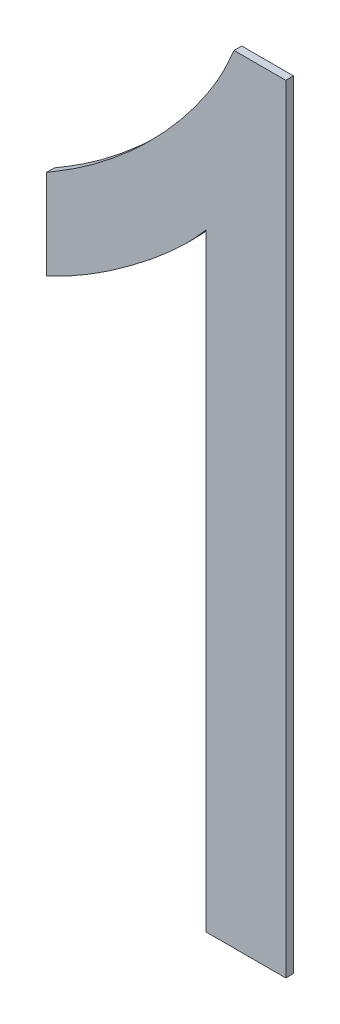
ISO-10303-21;
HEADER;
FILE_DESCRIPTION(('STEP AP214'),'2;1');
FILE_NAME('part.step','',(''),(''),'','','');
FILE_SCHEMA(('AUTOMOTIVE_DESIGN { 1 0 10303 214 1 1 1 1 }'));
ENDSEC;
DATA;
#1=APPLICATION_CONTEXT('core data for automotive mechanical design processes');
#2=APPLICATION_PROTOCOL_DEFINITION('international standard','automotive_design',2000,#1);
#3=PRODUCT_CONTEXT('',#1,'mechanical');
#4=PRODUCT('Part','Part','',(#3));
#5=PRODUCT_RELATED_PRODUCT_CATEGORY('part','',(#4));
#6=PRODUCT_DEFINITION_FORMATION('','',#4);
#7=PRODUCT_DEFINITION_CONTEXT('part definition',#1,'design');
#8=PRODUCT_DEFINITION('design','',#6,#7);
#9=PRODUCT_DEFINITION_SHAPE('','',#8);
#10=(LENGTH_UNIT() NAMED_UNIT(*) SI_UNIT(.MILLI.,.METRE.));
#11=(NAMED_UNIT(*) PLANE_ANGLE_UNIT() SI_UNIT($,.RADIAN.));
#12=(NAMED_UNIT(*) SI_UNIT($,.STERADIAN.) SOLID_ANGLE_UNIT());
#13=UNCERTAINTY_MEASURE_WITH_UNIT(LENGTH_MEASURE(1.E-05),#10,'distance_accuracy_value','');
#14=(GEOMETRIC_REPRESENTATION_CONTEXT(3) GLOBAL_UNCERTAINTY_ASSIGNED_CONTEXT((#13)) GLOBAL_UNIT_ASSIGNED_CONTEXT((#10,
#11,#12)) REPRESENTATION_CONTEXT('',''));
#15=CARTESIAN_POINT('',(0.,0.,0.));
#16=DIRECTION('',(0.,0.,1.));
#17=DIRECTION('',(1.,0.,0.));
#18=AXIS2_PLACEMENT_3D('',#15,#16,#17);
#19=CARTESIAN_POINT('',(58.1743453155129,26.8742028686675,2.91549564475552));
#20=DIRECTION('',(0.,0.,1.));
#21=DIRECTION('',(1.,0.,0.));
#22=AXIS2_PLACEMENT_3D('',#19,#20,#21);
#23=PLANE('',#22);
#24=DIRECTION('',(1.,0.,0.));
#25=VECTOR('',#24,1.);
#26=CARTESIAN_POINT('',(58.3745452295853,26.170000462748,2.91549564475552));
#27=LINE('',#26,#25);
#28=CARTESIAN_POINT('',(58.2706491256892,26.170000462748,2.91549564475552));
#29=VERTEX_POINT('',#28);
#30=CARTESIAN_POINT('',(58.3745452295853,26.170000462748,2.91549564475552));
#31=VERTEX_POINT('',#30);
#32=EDGE_CURVE('E123',#29,#31,#27,.T.);
#33=ORIENTED_EDGE('',*,*,#32,.F.);
#34=DIRECTION('',(0.,-1.,0.));
#35=VECTOR('',#34,1.);
#36=CARTESIAN_POINT('',(58.2706491256892,26.170000462748,2.91549564475552));
#37=LINE('',#36,#35);
#38=CARTESIAN_POINT('',(58.2706491256892,26.9622082549558,2.91549564475552));
#39=VERTEX_POINT('',#38);
#40=EDGE_CURVE('E126',#39,#29,#37,.T.);
#41=ORIENTED_EDGE('',*,*,#40,.F.);
#42=CARTESIAN_POINT('',(58.062856917897,26.8063640991116,2.91549564475552));
#43=CARTESIAN_POINT('',(58.065866863255,26.8077974042156,2.91549564475551));
#44=CARTESIAN_POINT('',(58.0688796080204,26.8092255044285,2.91549564475551));
#45=CARTESIAN_POINT('',(58.0748895244834,26.8121116580423,2.91549564475552));
#46=CARTESIAN_POINT('',(58.0778867005587,26.8135697023804,2.91549564475552));
#47=CARTESIAN_POINT('',(58.0868442865377,26.8180597651495,2.91549564475553));
#48=CARTESIAN_POINT('',(58.0927518760436,26.8211993494741,2.91549564475552));
#49=CARTESIAN_POINT('',(58.1044058272643,26.8277655902408,2.91549564475551));
#50=CARTESIAN_POINT('',(58.1101521124175,26.8311923800267,2.91549564475552));
#51=CARTESIAN_POINT('',(58.1272955683468,26.8416498466397,2.91549564475552));
#52=CARTESIAN_POINT('',(58.1385896613481,26.8488533489662,2.91549564475552));
#53=CARTESIAN_POINT('',(58.1551203664206,26.8602081022204,2.91549564475552));
#54=CARTESIAN_POINT('',(58.1605514245685,26.8640760719348,2.91549564475552));
#55=CARTESIAN_POINT('',(58.1713285643238,26.8719286843331,2.91549564475552));
#56=CARTESIAN_POINT('',(58.1766746366933,26.8759133395687,2.91549564475552));
#57=CARTESIAN_POINT('',(58.1872741399798,26.8839934929051,2.91549564475552));
#58=CARTESIAN_POINT('',(58.1925276618194,26.8880888708966,2.91549564475552));
#59=CARTESIAN_POINT('',(58.2029035866979,26.8964436602983,2.91549564475552));
#60=CARTESIAN_POINT('',(58.2080259836991,26.9007030792392,2.91549564475552));
#61=CARTESIAN_POINT('',(58.2182160142135,26.9094403138401,2.91549564475552));
#62=CARTESIAN_POINT('',(58.2232816300345,26.9139204657974,2.91549564475552));
#63=CARTESIAN_POINT('',(58.2333000981316,26.9230041410037,2.91549564475552));
#64=CARTESIAN_POINT('',(58.2382529799468,26.9276076312304,2.91549564475552));
#65=CARTESIAN_POINT('',(58.2455076860161,26.9347021503229,2.91549564475552));
#66=CARTESIAN_POINT('',(58.2478990069233,26.9371009062007,2.91549564475552));
#67=CARTESIAN_POINT('',(58.2526006522834,26.9419773170162,2.91549564475552));
#68=CARTESIAN_POINT('',(58.2549109622826,26.9444549858841,2.91549564475552));
#69=CARTESIAN_POINT('',(58.25947437728,26.9494660903726,2.91549564475552));
#70=CARTESIAN_POINT('',(58.2617274271182,26.951999575681,2.91549564475553));
#71=CARTESIAN_POINT('',(58.2662032792995,26.9570917109337,2.91549564475552));
#72=CARTESIAN_POINT('',(58.2684260916151,26.9596503520772,2.91549564475552));
#73=CARTESIAN_POINT('',(58.2706491256892,26.9622082549558,2.91549564475551));
#74=B_SPLINE_CURVE_WITH_KNOTS('',3,(#42,#43,#44,#45,#46,#47,#48,#49,#50,#51,#52,#53,#54,#55,#56,
#57,#58,#59,#60,#61,#62,#63,#64,#65,#66,#67,#68,#69,#70,#71,#72,#73),.UNSPECIFIED.,.F.,.F.,(4,2,
2,2,2,2,2,2,2,2,2,2,2,2,2,4),(0.,0.010001847268972,0.0200007107640943,0.040060332963255,
0.0601293205800113,0.100293640248044,0.12029354974647,0.140295618573345,0.160276797467611,
0.180258894757743,0.200544891582343,0.220825510313653,0.230985139908888,0.241146573014351,
0.251317449835132,0.261484886723193),.UNSPECIFIED.);
#75=CARTESIAN_POINT('',(58.062856917897,26.8063640991116,2.91549564475552));
#76=VERTEX_POINT('',#75);
#77=EDGE_CURVE('E86',#76,#39,#74,.T.);
#78=ORIENTED_EDGE('',*,*,#77,.F.);
#79=DIRECTION('',(0.,-1.,0.));
#80=VECTOR('',#79,1.);
#81=CARTESIAN_POINT('',(58.062856917897,26.8063640991116,2.91549564475552));
#82=LINE('',#81,#80);
#83=CARTESIAN_POINT('',(58.062856917897,26.9232472159948,2.91549564475552));
#84=VERTEX_POINT('',#83);
#85=EDGE_CURVE('E84',#84,#76,#82,.T.);
#86=ORIENTED_EDGE('',*,*,#85,.F.);
#87=CARTESIAN_POINT('',(58.3071750997152,27.182987475735,2.91549564475552));
#88=CARTESIAN_POINT('',(58.3058388196954,27.1799333253941,2.91549564475553));
#89=CARTESIAN_POINT('',(58.3045037543781,27.1768788234238,2.91549564475553));
#90=CARTESIAN_POINT('',(58.3018046805023,27.1707829365755,2.91549564475552));
#91=CARTESIAN_POINT('',(58.3004406738737,27.1677415508389,2.91549564475552));
#92=CARTESIAN_POINT('',(58.2962376004407,27.1586130404315,2.91549564475551));
#93=CARTESIAN_POINT('',(58.2933060358809,27.1525664836575,2.91549564475552));
#94=CARTESIAN_POINT('',(58.287008443503,27.140702659199,2.91549564475553));
#95=CARTESIAN_POINT('',(58.2836423786988,27.1348854110891,2.91549564475553));
#96=CARTESIAN_POINT('',(58.2766142265739,27.1234304012939,2.91549564475552));
#97=CARTESIAN_POINT('',(58.2729519123752,27.1177927818691,2.91549564475553));
#98=CARTESIAN_POINT('',(58.2654206461902,27.1066556966935,2.91549564475552));
#99=CARTESIAN_POINT('',(58.2615516435777,27.1011562652799,2.91549564475552));
#100=CARTESIAN_POINT('',(58.2525507776012,27.0888512674793,2.91549564475552));
#101=CARTESIAN_POINT('',(58.2473580501864,27.0820900311211,2.91549564475552));
#102=CARTESIAN_POINT('',(58.2366741386901,27.0688110263768,2.91549564475553));
#103=CARTESIAN_POINT('',(58.2311829976326,27.062293223121,2.91549564475552));
#104=CARTESIAN_POINT('',(58.2143146205282,27.0430774469248,2.91549564475552));
#105=CARTESIAN_POINT('',(58.2025443658314,27.0307197107892,2.91549564475552));
#106=CARTESIAN_POINT('',(58.1807006464426,27.0096257308247,2.91549564475552));
#107=CARTESIAN_POINT('',(58.1708196383605,27.0006888316662,2.91549564475552));
#108=CARTESIAN_POINT('',(58.1556015841505,26.9877509751638,2.91549564475552));
#109=CARTESIAN_POINT('',(58.1504619416585,26.9835156214841,2.91549564475552));
#110=CARTESIAN_POINT('',(58.1400695044533,26.9751868406897,2.91549564475552));
#111=CARTESIAN_POINT('',(58.1348167201312,26.9710934006306,2.91549564475552));
#112=CARTESIAN_POINT('',(58.1241902688453,26.9630773752128,2.91549564475552));
#113=CARTESIAN_POINT('',(58.1188167326587,26.959154617359,2.91549564475552));
#114=CARTESIAN_POINT('',(58.1079208644632,26.9515195167154,2.91549564475552));
#115=CARTESIAN_POINT('',(58.1023985152648,26.9478071983887,2.91549564475552));
#116=CARTESIAN_POINT('',(58.0912330599455,26.9405746466174,2.91549564475552));
#117=CARTESIAN_POINT('',(58.0855899877156,26.9370543602232,2.91549564475551));
#118=CARTESIAN_POINT('',(58.0742487255015,26.9301063894129,2.91549564475552));
#119=CARTESIAN_POINT('',(58.0685505499406,26.9266786816104,2.91549564475552));
#120=CARTESIAN_POINT('',(58.062856917897,26.9232472159948,2.91549564475553));
#121=B_SPLINE_CURVE_WITH_KNOTS('',3,(#87,#88,#89,#90,#91,#92,#93,#94,#95,#96,#97,#98,#99,#100,
#101,#102,#103,#104,#105,#106,#107,#108,#109,#110,#111,#112,#113,#114,#115,#116,#117,#118,#119,
#120),.UNSPECIFIED.,.F.,.F.,(4,2,2,2,2,2,2,2,2,2,2,2,2,2,2,2,4),(0.,0.0100006477746493,
0.0200006307128625,0.0401463791712754,0.0602938436370256,0.0804568865149613,0.10062489095737,
0.126190331127146,0.151752095105202,0.202885326196961,0.242827177162792,0.262804596179576,
0.28278018817464,0.302735099846907,0.322692326496227,0.342644022169759,0.362590629734804),.UNSPECIFIED.);
#122=CARTESIAN_POINT('',(58.3071750997152,27.182987475735,2.91549564475552));
#123=VERTEX_POINT('',#122);
#124=EDGE_CURVE('E24',#123,#84,#121,.T.);
#125=ORIENTED_EDGE('',*,*,#124,.F.);
#126=DIRECTION('',(-1.,0.,0.));
#127=VECTOR('',#126,1.);
#128=CARTESIAN_POINT('',(58.3071750997152,27.182987475735,2.91549564475552));
#129=LINE('',#128,#127);
#130=CARTESIAN_POINT('',(58.3745452295853,27.182987475735,2.91549564475552));
#131=VERTEX_POINT('',#130);
#132=EDGE_CURVE('E111',#131,#123,#129,.T.);
#133=ORIENTED_EDGE('',*,*,#132,.F.);
#134=DIRECTION('',(0.,1.,0.));
#135=VECTOR('',#134,1.);
#136=CARTESIAN_POINT('',(58.3745452295853,27.182987475735,2.91549564475552));
#137=LINE('',#136,#135);
#138=EDGE_CURVE('E135',#31,#131,#137,.T.);
#139=ORIENTED_EDGE('',*,*,#138,.F.);
#140=EDGE_LOOP('',(#33,#41,#78,#86,#125,#133,#139));
#141=FACE_BOUND('',#140,.T.);
#142=ADVANCED_FACE('F17',(#141),#23,.F.);
#143=CARTESIAN_POINT('',(58.3745452295853,27.182987475735,2.92549564475551));
#144=DIRECTION('',(1.,0.,0.));
#145=DIRECTION('',(0.,1.,0.));
#146=AXIS2_PLACEMENT_3D('',#143,#144,#145);
#147=PLANE('',#146);
#148=DIRECTION('',(0.,1.,0.));
#149=VECTOR('',#148,1.);
#150=CARTESIAN_POINT('',(58.3745452295853,26.8742028686675,2.92549564475552));
#151=LINE('',#150,#149);
#152=CARTESIAN_POINT('',(58.3745452295853,26.170000462748,2.92549564475552));
#153=VERTEX_POINT('',#152);
#154=CARTESIAN_POINT('',(58.3745452295853,27.182987475735,2.92549564475552));
#155=VERTEX_POINT('',#154);
#156=EDGE_CURVE('E114',#153,#155,#151,.T.);
#157=ORIENTED_EDGE('',*,*,#156,.F.);
#158=DIRECTION('',(0.,0.,1.));
#159=VECTOR('',#158,1.);
#160=CARTESIAN_POINT('',(58.3745452295853,26.170000462748,2.92549564475551));
#161=LINE('',#160,#159);
#162=EDGE_CURVE('E120',#31,#153,#161,.T.);
#163=ORIENTED_EDGE('',*,*,#162,.F.);
#164=ORIENTED_EDGE('',*,*,#138,.T.);
#165=DIRECTION('',(0.,0.,1.));
#166=VECTOR('',#165,1.);
#167=CARTESIAN_POINT('',(58.3745452295853,27.182987475735,2.92549564475551));
#168=LINE('',#167,#166);
#169=EDGE_CURVE('E98',#155,#131,#168,.F.);
#170=ORIENTED_EDGE('',*,*,#169,.F.);
#171=EDGE_LOOP('',(#157,#163,#164,#170));
#172=FACE_BOUND('',#171,.T.);
#173=ADVANCED_FACE('F172',(#172),#147,.T.);
#174=CARTESIAN_POINT('',(58.3071750997152,27.182987475735,2.92549564475551));
#175=DIRECTION('',(0.,1.,0.));
#176=DIRECTION('',(-1.,0.,0.));
#177=AXIS2_PLACEMENT_3D('',#174,#175,#176);
#178=PLANE('',#177);
#179=DIRECTION('',(1.,0.,0.));
#180=VECTOR('',#179,1.);
#181=CARTESIAN_POINT('',(58.1743453155129,27.182987475735,2.92549564475551));
#182=LINE('',#181,#180);
#183=CARTESIAN_POINT('',(58.3071750997152,27.182987475735,2.92549564475551));
#184=VERTEX_POINT('',#183);
#185=EDGE_CURVE('E117',#155,#184,#182,.F.);
#186=ORIENTED_EDGE('',*,*,#185,.F.);
#187=ORIENTED_EDGE('',*,*,#169,.T.);
#188=ORIENTED_EDGE('',*,*,#132,.T.);
#189=DIRECTION('',(0.,0.,-1.));
#190=VECTOR('',#189,1.);
#191=CARTESIAN_POINT('',(58.3071750997152,27.182987475735,2.92049564475552));
#192=LINE('',#191,#190);
#193=EDGE_CURVE('E91',#184,#123,#192,.T.);
#194=ORIENTED_EDGE('',*,*,#193,.F.);
#195=EDGE_LOOP('',(#186,#187,#188,#194));
#196=FACE_BOUND('',#195,.T.);
#197=ADVANCED_FACE('F169',(#196),#178,.T.);
#198=CARTESIAN_POINT('',(58.062856917897,26.9232472159948,2.92549564475551));
#199=CARTESIAN_POINT('',(58.062856917897,26.9232472159948,2.91549564475552));
#200=CARTESIAN_POINT('',(58.0768699526042,26.9316820539989,2.92549564475551));
#201=CARTESIAN_POINT('',(58.0768699526042,26.9316820539989,2.91549564475552));
#202=CARTESIAN_POINT('',(58.1047760319953,26.948479504652,2.92549564475551));
#203=CARTESIAN_POINT('',(58.1047760319953,26.948479504652,2.91549564475552));
#204=CARTESIAN_POINT('',(58.1438896877577,26.9775635811955,2.92549564475551));
#205=CARTESIAN_POINT('',(58.1438896877577,26.9775635811955,2.91549564475552));
#206=CARTESIAN_POINT('',(58.1808222893721,27.0090432588623,2.92549564475551));
#207=CARTESIAN_POINT('',(58.1808222893721,27.0090432588623,2.91549564475552));
#208=CARTESIAN_POINT('',(58.2146838854584,27.0429586692716,2.92549564475551));
#209=CARTESIAN_POINT('',(58.2146838854584,27.0429586692716,2.91549564475552));
#210=CARTESIAN_POINT('',(58.2448641482385,27.0780495871445,2.92549564475551));
#211=CARTESIAN_POINT('',(58.2448641482385,27.0780495871445,2.91549564475552));
#212=CARTESIAN_POINT('',(58.2705005129144,27.113195805795,2.92549564475551));
#213=CARTESIAN_POINT('',(58.2705005129144,27.113195805795,2.91549564475552));
#214=CARTESIAN_POINT('',(58.2917484560982,27.1477049930124,2.92549564475551));
#215=CARTESIAN_POINT('',(58.2917484560982,27.1477049930124,2.91549564475552));
#216=CARTESIAN_POINT('',(58.302150686457,27.171496073044,2.92549564475551));
#217=CARTESIAN_POINT('',(58.302150686457,27.171496073044,2.91549564475552));
#218=CARTESIAN_POINT('',(58.3071750997152,27.182987475735,2.92549564475551));
#219=CARTESIAN_POINT('',(58.3071750997152,27.182987475735,2.91549564475552));
#220=B_SPLINE_SURFACE_WITH_KNOTS('',3,1,((#198,#199),(#200,#201),(#202,#203),(#204,#205),(#206,
#207),(#208,#209),(#210,#211),(#212,#213),(#214,#215),(#216,#217),(#218,#219)),.UNSPECIFIED.,
.F.,.F.,.F.,(4,1,1,1,1,1,1,1,4),(2,2),(0.,0.13527525967826,0.26939219199274,0.402774776977784,
0.536551389096526,0.665562751742143,0.785356715344345,0.89632448734492,1.),(0.,1.),.UNSPECIFIED.);
#221=CARTESIAN_POINT('',(58.3071750997152,27.182987475735,2.92549564475551));
#222=CARTESIAN_POINT('',(58.3058388196954,27.1799333253941,2.92549564475552));
#223=CARTESIAN_POINT('',(58.3045037543781,27.1768788234238,2.92549564475552));
#224=CARTESIAN_POINT('',(58.3018046805023,27.1707829365755,2.92549564475551));
#225=CARTESIAN_POINT('',(58.3004406738737,27.1677415508389,2.92549564475551));
#226=CARTESIAN_POINT('',(58.2962376004407,27.1586130404315,2.9254956447555));
#227=CARTESIAN_POINT('',(58.2933060358809,27.1525664836575,2.92549564475551));
#228=CARTESIAN_POINT('',(58.287008443503,27.140702659199,2.92549564475552));
#229=CARTESIAN_POINT('',(58.2836423786988,27.1348854110891,2.92549564475552));
#230=CARTESIAN_POINT('',(58.2766142265739,27.1234304012939,2.92549564475551));
#231=CARTESIAN_POINT('',(58.2729519123752,27.117792781869,2.92549564475552));
#232=CARTESIAN_POINT('',(58.2654206461902,27.1066556966935,2.92549564475551));
#233=CARTESIAN_POINT('',(58.2615516435777,27.1011562652799,2.92549564475551));
#234=CARTESIAN_POINT('',(58.2525507776012,27.0888512674793,2.92549564475551));
#235=CARTESIAN_POINT('',(58.2473580501864,27.0820900311211,2.92549564475551));
#236=CARTESIAN_POINT('',(58.2366741386901,27.0688110263768,2.92549564475552));
#237=CARTESIAN_POINT('',(58.2311829976326,27.062293223121,2.92549564475551));
#238=CARTESIAN_POINT('',(58.2143146205282,27.0430774469248,2.92549564475551));
#239=CARTESIAN_POINT('',(58.2025443658314,27.0307197107892,2.92549564475551));
#240=CARTESIAN_POINT('',(58.1807006464426,27.0096257308247,2.92549564475551));
#241=CARTESIAN_POINT('',(58.1708196383605,27.0006888316662,2.92549564475551));
#242=CARTESIAN_POINT('',(58.1556015841505,26.9877509751638,2.92549564475551));
#243=CARTESIAN_POINT('',(58.1504619416585,26.9835156214841,2.92549564475551));
#244=CARTESIAN_POINT('',(58.1400695044533,26.9751868406897,2.92549564475551));
#245=CARTESIAN_POINT('',(58.1348167201312,26.9710934006306,2.92549564475551));
#246=CARTESIAN_POINT('',(58.1241902688453,26.9630773752128,2.92549564475551));
#247=CARTESIAN_POINT('',(58.1188167326587,26.959154617359,2.92549564475551));
#248=CARTESIAN_POINT('',(58.1079208644632,26.9515195167154,2.92549564475551));
#249=CARTESIAN_POINT('',(58.1023985152647,26.9478071983887,2.92549564475551));
#250=CARTESIAN_POINT('',(58.0912330599455,26.9405746466174,2.92549564475551));
#251=CARTESIAN_POINT('',(58.0855899877155,26.9370543602232,2.9254956447555));
#252=CARTESIAN_POINT('',(58.0742487255015,26.9301063894129,2.92549564475551));
#253=CARTESIAN_POINT('',(58.0685505499406,26.9266786816104,2.92549564475551));
#254=CARTESIAN_POINT('',(58.062856917897,26.9232472159948,2.92549564475552));
#255=B_SPLINE_CURVE_WITH_KNOTS('',3,(#221,#222,#223,#224,#225,#226,#227,#228,#229,#230,#231,
#232,#233,#234,#235,#236,#237,#238,#239,#240,#241,#242,#243,#244,#245,#246,#247,#248,#249,#250,
#251,#252,#253,#254),.UNSPECIFIED.,.F.,.F.,(4,2,2,2,2,2,2,2,2,2,2,2,2,2,2,2,4),(0.,
0.0100006477746493,0.0200006307128625,0.0401463791712784,0.0602938436370277,0.0804568865149643,
0.100624890957369,0.126190331127141,0.151752095105203,0.202885326196959,0.24282717716279,
0.262804596179574,0.282780188174638,0.302735099846908,0.322692326496222,0.342644022169765,
0.362590629734802),.UNSPECIFIED.);
#256=CARTESIAN_POINT('',(58.062856917897,26.9232472159948,2.9254956447555));
#257=VERTEX_POINT('',#256);
#258=EDGE_CURVE('E150',#184,#257,#255,.T.);
#259=DIRECTION('',(0.,0.,1.));
#260=VECTOR('',#259,1.);
#261=CARTESIAN_POINT('',(58.062856917897,26.9232472159948,2.92549564475551));
#262=LINE('',#261,#260);
#263=EDGE_CURVE('E90',#257,#84,#262,.F.);
#264=ORIENTED_EDGE('',*,*,#258,.F.);
#265=ORIENTED_EDGE('',*,*,#193,.T.);
#266=ORIENTED_EDGE('',*,*,#124,.T.);
#267=ORIENTED_EDGE('',*,*,#263,.F.);
#268=EDGE_LOOP('',(#264,#265,#266,#267));
#269=FACE_BOUND('',#268,.T.);
#270=ADVANCED_FACE('F96',(#269),#220,.T.);
#271=CARTESIAN_POINT('',(58.062856917897,26.8063640991116,2.92549564475551));
#272=DIRECTION('',(-1.,0.,0.));
#273=DIRECTION('',(0.,-1.,0.));
#274=AXIS2_PLACEMENT_3D('',#271,#272,#273);
#275=PLANE('',#274);
#276=DIRECTION('',(0.,1.,0.));
#277=VECTOR('',#276,1.);
#278=CARTESIAN_POINT('',(58.062856917897,26.8742028686675,2.9254956447555));
#279=LINE('',#278,#277);
#280=CARTESIAN_POINT('',(58.062856917897,26.8063640991116,2.92549564475551));
#281=VERTEX_POINT('',#280);
#282=EDGE_CURVE('E101',#257,#281,#279,.F.);
#283=ORIENTED_EDGE('',*,*,#282,.F.);
#284=ORIENTED_EDGE('',*,*,#263,.T.);
#285=ORIENTED_EDGE('',*,*,#85,.T.);
#286=DIRECTION('',(0.,0.,-1.));
#287=VECTOR('',#286,1.);
#288=CARTESIAN_POINT('',(58.062856917897,26.8063640991116,2.92049564475552));
#289=LINE('',#288,#287);
#290=EDGE_CURVE('E104',#281,#76,#289,.T.);
#291=ORIENTED_EDGE('',*,*,#290,.F.);
#292=EDGE_LOOP('',(#283,#284,#285,#291));
#293=FACE_BOUND('',#292,.T.);
#294=ADVANCED_FACE('F99',(#293),#275,.T.);
#295=CARTESIAN_POINT('',(58.2706491256892,26.9622082549558,2.92549564475551));
#296=CARTESIAN_POINT('',(58.2706491256892,26.9622082549558,2.91549564475552));
#297=CARTESIAN_POINT('',(58.2642680764825,26.9548641128363,2.92549564475551));
#298=CARTESIAN_POINT('',(58.2642680764825,26.9548641128363,2.91549564475552));
#299=CARTESIAN_POINT('',(58.251043358538,26.9396433858168,2.92549564475551));
#300=CARTESIAN_POINT('',(58.251043358538,26.9396433858168,2.91549564475552));
#301=CARTESIAN_POINT('',(58.2280943384595,26.9179870513999,2.92549564475551));
#302=CARTESIAN_POINT('',(58.2280943384595,26.9179870513999,2.91549564475552));
#303=CARTESIAN_POINT('',(58.2025230194608,26.8957368411787,2.92549564475551));
#304=CARTESIAN_POINT('',(58.2025230194608,26.8957368411787,2.91549564475552));
#305=CARTESIAN_POINT('',(58.1743661473454,26.8739518408834,2.92549564475551));
#306=CARTESIAN_POINT('',(58.1743661473454,26.8739518408834,2.91549564475552));
#307=CARTESIAN_POINT('',(58.145498402164,26.8532020101906,2.92549564475551));
#308=CARTESIAN_POINT('',(58.145498402164,26.8532020101906,2.91549564475552));
#309=CARTESIAN_POINT('',(58.1168536241549,26.8350718625342,2.92549564475551));
#310=CARTESIAN_POINT('',(58.1168536241549,26.8350718625342,2.91549564475552));
#311=CARTESIAN_POINT('',(58.0897474480271,26.819130216743,2.92549564475551));
#312=CARTESIAN_POINT('',(58.0897474480271,26.819130216743,2.91549564475552));
#313=CARTESIAN_POINT('',(58.0715782675722,26.8105045074754,2.92549564475551));
#314=CARTESIAN_POINT('',(58.0715782675722,26.8105045074754,2.91549564475552));
#315=CARTESIAN_POINT('',(58.062856917897,26.8063640991116,2.92549564475551));
#316=CARTESIAN_POINT('',(58.062856917897,26.8063640991116,2.91549564475552));
#317=B_SPLINE_SURFACE_WITH_KNOTS('',3,1,((#295,#296),(#297,#298),(#299,#300),(#301,#302),(#303,
#304),(#305,#306),(#307,#308),(#309,#310),(#311,#312),(#313,#314),(#315,#316)),.UNSPECIFIED.,
.F.,.F.,.F.,(4,1,1,1,1,1,1,1,4),(2,2),(0.,0.111564928198082,0.231218199407737,0.361612236715671,
0.500401543042023,0.639518114085957,0.769338113010696,0.889280478106504,1.),(0.,1.),.UNSPECIFIED.);
#318=CARTESIAN_POINT('',(58.062856917897,26.8063640991116,2.92549564475551));
#319=CARTESIAN_POINT('',(58.065866863255,26.8077974042156,2.9254956447555));
#320=CARTESIAN_POINT('',(58.0688796080204,26.8092255044285,2.9254956447555));
#321=CARTESIAN_POINT('',(58.0748895244834,26.8121116580423,2.92549564475551));
#322=CARTESIAN_POINT('',(58.0778867005587,26.8135697023804,2.92549564475551));
#323=CARTESIAN_POINT('',(58.0868442865377,26.8180597651495,2.92549564475552));
#324=CARTESIAN_POINT('',(58.0927518760436,26.8211993494741,2.92549564475551));
#325=CARTESIAN_POINT('',(58.1044058272643,26.8277655902408,2.9254956447555));
#326=CARTESIAN_POINT('',(58.1101521124175,26.8311923800267,2.92549564475551));
#327=CARTESIAN_POINT('',(58.1272955683468,26.8416498466396,2.92549564475551));
#328=CARTESIAN_POINT('',(58.1385896613481,26.8488533489662,2.92549564475551));
#329=CARTESIAN_POINT('',(58.1551203664206,26.8602081022204,2.92549564475551));
#330=CARTESIAN_POINT('',(58.1605514245685,26.8640760719348,2.92549564475551));
#331=CARTESIAN_POINT('',(58.1713285643238,26.8719286843331,2.92549564475551));
#332=CARTESIAN_POINT('',(58.1766746366933,26.8759133395687,2.92549564475551));
#333=CARTESIAN_POINT('',(58.1872741399798,26.8839934929051,2.92549564475551));
#334=CARTESIAN_POINT('',(58.1925276618194,26.8880888708966,2.92549564475551));
#335=CARTESIAN_POINT('',(58.2029035866979,26.8964436602982,2.92549564475551));
#336=CARTESIAN_POINT('',(58.2080259836991,26.9007030792392,2.92549564475551));
#337=CARTESIAN_POINT('',(58.2182160142135,26.9094403138401,2.92549564475551));
#338=CARTESIAN_POINT('',(58.2232816300345,26.9139204657974,2.92549564475551));
#339=CARTESIAN_POINT('',(58.2333000981316,26.9230041410037,2.92549564475551));
#340=CARTESIAN_POINT('',(58.2382529799468,26.9276076312304,2.92549564475551));
#341=CARTESIAN_POINT('',(58.2455076860161,26.9347021503229,2.92549564475551));
#342=CARTESIAN_POINT('',(58.2478990069233,26.9371009062007,2.92549564475551));
#343=CARTESIAN_POINT('',(58.2526006522834,26.9419773170162,2.92549564475551));
#344=CARTESIAN_POINT('',(58.2549109622826,26.9444549858841,2.92549564475551));
#345=CARTESIAN_POINT('',(58.25947437728,26.9494660903726,2.92549564475551));
#346=CARTESIAN_POINT('',(58.2617274271182,26.951999575681,2.92549564475552));
#347=CARTESIAN_POINT('',(58.2662032792995,26.9570917109337,2.92549564475551));
#348=CARTESIAN_POINT('',(58.2684260916151,26.9596503520772,2.92549564475551));
#349=CARTESIAN_POINT('',(58.2706491256892,26.9622082549558,2.9254956447555));
#350=B_SPLINE_CURVE_WITH_KNOTS('',3,(#318,#319,#320,#321,#322,#323,#324,#325,#326,#327,#328,
#329,#330,#331,#332,#333,#334,#335,#336,#337,#338,#339,#340,#341,#342,#343,#344,#345,#346,#347,
#348,#349),.UNSPECIFIED.,.F.,.F.,(4,2,2,2,2,2,2,2,2,2,2,2,2,2,2,4),(0.,0.0100018472689705,
0.0200007107640943,0.0400603329632534,0.0601293205800097,0.100293640248044,0.120293549746462,
0.140295618573347,0.160276797467609,0.180258894757743,0.200544891582343,0.220825510313653,
0.230985139908888,0.241146573014352,0.251317449835132,0.261484886723193),.UNSPECIFIED.);
#351=CARTESIAN_POINT('',(58.2706491256892,26.9622082549558,2.92549564475552));
#352=VERTEX_POINT('',#351);
#353=EDGE_CURVE('E143',#281,#352,#350,.T.);
#354=DIRECTION('',(0.,0.,1.));
#355=VECTOR('',#354,1.);
#356=CARTESIAN_POINT('',(58.2706491256892,26.9622082549558,2.92549564475551));
#357=LINE('',#356,#355);
#358=EDGE_CURVE('E128',#352,#39,#357,.F.);
#359=ORIENTED_EDGE('',*,*,#353,.F.);
#360=ORIENTED_EDGE('',*,*,#290,.T.);
#361=ORIENTED_EDGE('',*,*,#77,.T.);
#362=ORIENTED_EDGE('',*,*,#358,.F.);
#363=EDGE_LOOP('',(#359,#360,#361,#362));
#364=FACE_BOUND('',#363,.T.);
#365=ADVANCED_FACE('F19',(#364),#317,.T.);
#366=CARTESIAN_POINT('',(58.2706491256892,26.170000462748,2.92549564475551));
#367=DIRECTION('',(-1.,0.,0.));
#368=DIRECTION('',(0.,-1.,0.));
#369=AXIS2_PLACEMENT_3D('',#366,#367,#368);
#370=PLANE('',#369);
#371=DIRECTION('',(0.,1.,0.));
#372=VECTOR('',#371,1.);
#373=CARTESIAN_POINT('',(58.2706491256892,26.8742028686675,2.92549564475552));
#374=LINE('',#373,#372);
#375=CARTESIAN_POINT('',(58.2706491256892,26.170000462748,2.92549564475552));
#376=VERTEX_POINT('',#375);
#377=EDGE_CURVE('E34',#352,#376,#374,.F.);
#378=ORIENTED_EDGE('',*,*,#377,.F.);
#379=ORIENTED_EDGE('',*,*,#358,.T.);
#380=ORIENTED_EDGE('',*,*,#40,.T.);
#381=DIRECTION('',(0.,0.,1.));
#382=VECTOR('',#381,1.);
#383=CARTESIAN_POINT('',(58.2706491256892,26.170000462748,2.92549564475551));
#384=LINE('',#383,#382);
#385=EDGE_CURVE('E43',#376,#29,#384,.F.);
#386=ORIENTED_EDGE('',*,*,#385,.F.);
#387=EDGE_LOOP('',(#378,#379,#380,#386));
#388=FACE_BOUND('',#387,.T.);
#389=ADVANCED_FACE('F163',(#388),#370,.T.);
#390=CARTESIAN_POINT('',(58.3745452295853,26.170000462748,2.92549564475551));
#391=DIRECTION('',(0.,-1.,0.));
#392=DIRECTION('',(1.,0.,0.));
#393=AXIS2_PLACEMENT_3D('',#390,#391,#392);
#394=PLANE('',#393);
#395=DIRECTION('',(1.,0.,0.));
#396=VECTOR('',#395,1.);
#397=CARTESIAN_POINT('',(58.1743453155129,26.170000462748,2.92549564475551));
#398=LINE('',#397,#396);
#399=EDGE_CURVE('E11',#376,#153,#398,.T.);
#400=ORIENTED_EDGE('',*,*,#399,.F.);
#401=ORIENTED_EDGE('',*,*,#385,.T.);
#402=ORIENTED_EDGE('',*,*,#32,.T.);
#403=ORIENTED_EDGE('',*,*,#162,.T.);
#404=EDGE_LOOP('',(#400,#401,#402,#403));
#405=FACE_BOUND('',#404,.T.);
#406=ADVANCED_FACE('F158',(#405),#394,.T.);
#407=CARTESIAN_POINT('',(58.1743453155129,26.8742028686675,2.92549564475551));
#408=DIRECTION('',(0.,0.,1.));
#409=DIRECTION('',(1.,0.,0.));
#410=AXIS2_PLACEMENT_3D('',#407,#408,#409);
#411=PLANE('',#410);
#412=ORIENTED_EDGE('',*,*,#377,.T.);
#413=ORIENTED_EDGE('',*,*,#399,.T.);
#414=ORIENTED_EDGE('',*,*,#156,.T.);
#415=ORIENTED_EDGE('',*,*,#185,.T.);
#416=ORIENTED_EDGE('',*,*,#258,.T.);
#417=ORIENTED_EDGE('',*,*,#282,.T.);
#418=ORIENTED_EDGE('',*,*,#353,.T.);
#419=EDGE_LOOP('',(#412,#413,#414,#415,#416,#417,#418));
#420=FACE_BOUND('',#419,.T.);
#421=ADVANCED_FACE('F154',(#420),#411,.T.);
#422=CLOSED_SHELL('',(#142,#173,#197,#270,#294,#365,#389,#406,#421));
#423=MANIFOLD_SOLID_BREP('B1',#422);
#424=ADVANCED_BREP_SHAPE_REPRESENTATION('',(#18,#423),#14);
#425=SHAPE_DEFINITION_REPRESENTATION(#9,#424);
ENDSEC;
END-ISO-10303-21;
